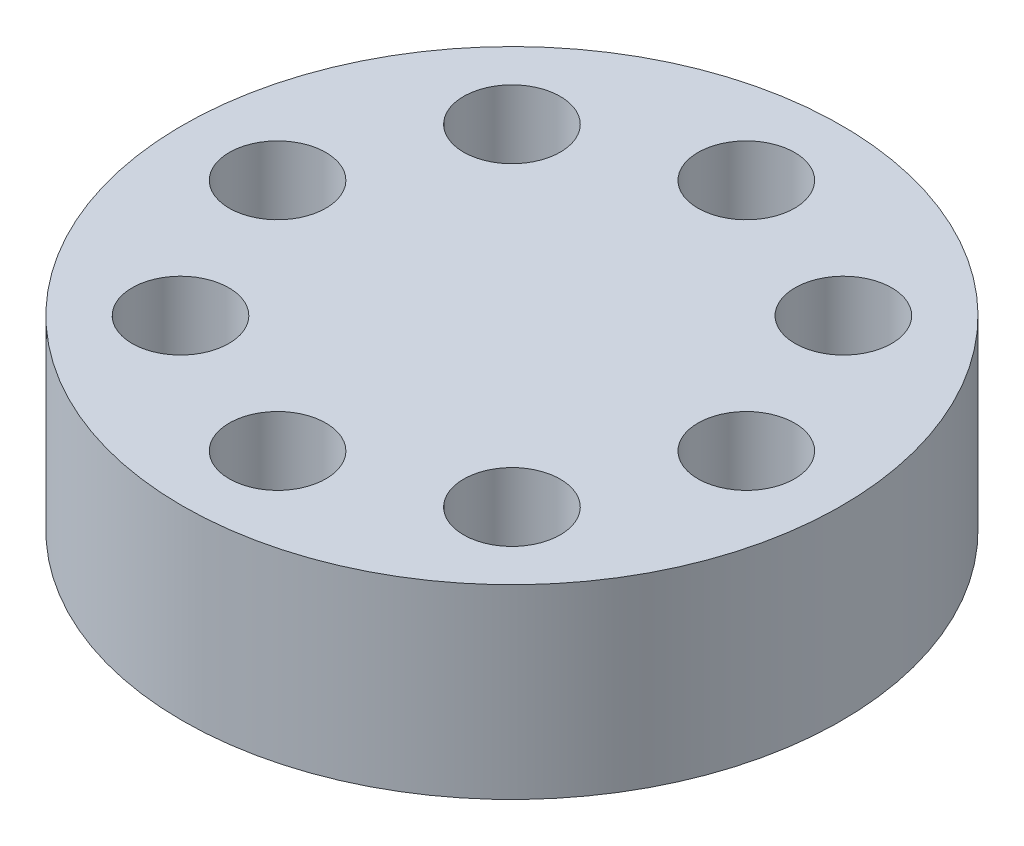
ISO-10303-21;
HEADER;
FILE_DESCRIPTION(('STEP AP214'),'2;1');
FILE_NAME('part.step','',(''),(''),'','','');
FILE_SCHEMA(('AUTOMOTIVE_DESIGN { 1 0 10303 214 1 1 1 1 }'));
ENDSEC;
DATA;
#1=APPLICATION_CONTEXT('core data for automotive mechanical design processes');
#2=APPLICATION_PROTOCOL_DEFINITION('international standard','automotive_design',2000,#1);
#3=PRODUCT_CONTEXT('',#1,'mechanical');
#4=PRODUCT('Part','Part','',(#3));
#5=PRODUCT_RELATED_PRODUCT_CATEGORY('part','',(#4));
#6=PRODUCT_DEFINITION_FORMATION('','',#4);
#7=PRODUCT_DEFINITION_CONTEXT('part definition',#1,'design');
#8=PRODUCT_DEFINITION('design','',#6,#7);
#9=PRODUCT_DEFINITION_SHAPE('','',#8);
#10=(LENGTH_UNIT() NAMED_UNIT(*) SI_UNIT(.MILLI.,.METRE.));
#11=(NAMED_UNIT(*) PLANE_ANGLE_UNIT() SI_UNIT($,.RADIAN.));
#12=(NAMED_UNIT(*) SI_UNIT($,.STERADIAN.) SOLID_ANGLE_UNIT());
#13=UNCERTAINTY_MEASURE_WITH_UNIT(LENGTH_MEASURE(1.E-05),#10,'distance_accuracy_value','');
#14=(GEOMETRIC_REPRESENTATION_CONTEXT(3) GLOBAL_UNCERTAINTY_ASSIGNED_CONTEXT((#13)) GLOBAL_UNIT_ASSIGNED_CONTEXT((#10,
#11,#12)) REPRESENTATION_CONTEXT('',''));
#15=CARTESIAN_POINT('',(0.,0.,0.));
#16=DIRECTION('',(0.,0.,1.));
#17=DIRECTION('',(1.,0.,0.));
#18=AXIS2_PLACEMENT_3D('',#15,#16,#17);
#19=CARTESIAN_POINT('',(0.,12.7,0.));
#20=DIRECTION('',(0.,-1.,0.));
#21=DIRECTION('',(0.,0.,-1.));
#22=AXIS2_PLACEMENT_3D('',#19,#20,#21);
#23=CYLINDRICAL_SURFACE('',#22,22.5);
#24=CARTESIAN_POINT('',(0.,12.7,0.));
#25=DIRECTION('',(0.,1.,0.));
#26=DIRECTION('',(0.,0.,1.));
#27=AXIS2_PLACEMENT_3D('',#24,#25,#26);
#28=CIRCLE('',#27,22.5);
#29=CARTESIAN_POINT('',(0.,12.7,22.5));
#30=VERTEX_POINT('',#29);
#31=EDGE_CURVE('E10',#30,#30,#28,.T.);
#32=ORIENTED_EDGE('',*,*,#31,.F.);
#33=EDGE_LOOP('',(#32));
#34=FACE_BOUND('',#33,.T.);
#35=CARTESIAN_POINT('',(0.,0.,0.));
#36=DIRECTION('',(0.,1.,0.));
#37=DIRECTION('',(0.,0.,1.));
#38=AXIS2_PLACEMENT_3D('',#35,#36,#37);
#39=CIRCLE('',#38,22.5);
#40=CARTESIAN_POINT('',(0.,0.,22.5));
#41=VERTEX_POINT('',#40);
#42=EDGE_CURVE('E40',#41,#41,#39,.T.);
#43=ORIENTED_EDGE('',*,*,#42,.T.);
#44=EDGE_LOOP('',(#43));
#45=FACE_BOUND('',#44,.T.);
#46=ADVANCED_FACE('F37',(#34,#45),#23,.T.);
#47=CARTESIAN_POINT('',(0.,12.7,0.));
#48=DIRECTION('',(0.,1.,0.));
#49=DIRECTION('',(0.,0.,1.));
#50=AXIS2_PLACEMENT_3D('',#47,#48,#49);
#51=PLANE('',#50);
#52=CARTESIAN_POINT('',(-11.3137084989848,12.7,11.3137084989848));
#53=DIRECTION('',(0.,1.,0.));
#54=DIRECTION('',(0.,0.,1.));
#55=AXIS2_PLACEMENT_3D('',#52,#53,#54);
#56=CIRCLE('',#55,3.3);
#57=CARTESIAN_POINT('',(-11.3137084989848,12.7,14.6137084989848));
#58=VERTEX_POINT('',#57);
#59=EDGE_CURVE('E58',#58,#58,#56,.T.);
#60=ORIENTED_EDGE('',*,*,#59,.F.);
#61=EDGE_LOOP('',(#60));
#62=FACE_BOUND('',#61,.T.);
#63=CARTESIAN_POINT('',(-1.6759110426447E-13,12.7,16.));
#64=DIRECTION('',(0.,1.,0.));
#65=DIRECTION('',(0.,0.,1.));
#66=AXIS2_PLACEMENT_3D('',#63,#64,#65);
#67=CIRCLE('',#66,3.3);
#68=CARTESIAN_POINT('',(-1.6759110426447E-13,12.7,19.3));
#69=VERTEX_POINT('',#68);
#70=EDGE_CURVE('E64',#69,#69,#67,.T.);
#71=ORIENTED_EDGE('',*,*,#70,.F.);
#72=EDGE_LOOP('',(#71));
#73=FACE_BOUND('',#72,.T.);
#74=CARTESIAN_POINT('',(11.3137084989847,12.7,11.3137084989849));
#75=DIRECTION('',(0.,1.,0.));
#76=DIRECTION('',(0.,0.,1.));
#77=AXIS2_PLACEMENT_3D('',#74,#75,#76);
#78=CIRCLE('',#77,3.3);
#79=CARTESIAN_POINT('',(11.3137084989847,12.7,14.6137084989849));
#80=VERTEX_POINT('',#79);
#81=EDGE_CURVE('E70',#80,#80,#78,.T.);
#82=ORIENTED_EDGE('',*,*,#81,.F.);
#83=EDGE_LOOP('',(#82));
#84=FACE_BOUND('',#83,.T.);
#85=CARTESIAN_POINT('',(16.,12.7,1.1172740284298E-13));
#86=DIRECTION('',(0.,1.,0.));
#87=DIRECTION('',(0.,0.,1.));
#88=AXIS2_PLACEMENT_3D('',#85,#86,#87);
#89=CIRCLE('',#88,3.3);
#90=CARTESIAN_POINT('',(16.,12.7,3.30000000000011));
#91=VERTEX_POINT('',#90);
#92=EDGE_CURVE('E76',#91,#91,#89,.T.);
#93=ORIENTED_EDGE('',*,*,#92,.F.);
#94=EDGE_LOOP('',(#93));
#95=FACE_BOUND('',#94,.T.);
#96=CARTESIAN_POINT('',(11.3137084989848,12.7,-11.3137084989847));
#97=DIRECTION('',(0.,1.,0.));
#98=DIRECTION('',(0.,0.,1.));
#99=AXIS2_PLACEMENT_3D('',#96,#97,#98);
#100=CIRCLE('',#99,3.3);
#101=CARTESIAN_POINT('',(11.3137084989848,12.7,-8.0137084989847));
#102=VERTEX_POINT('',#101);
#103=EDGE_CURVE('E82',#102,#102,#100,.T.);
#104=ORIENTED_EDGE('',*,*,#103,.F.);
#105=EDGE_LOOP('',(#104));
#106=FACE_BOUND('',#105,.T.);
#107=CARTESIAN_POINT('',(0.,12.7,-16.));
#108=DIRECTION('',(0.,1.,0.));
#109=DIRECTION('',(0.,0.,1.));
#110=AXIS2_PLACEMENT_3D('',#107,#108,#109);
#111=CIRCLE('',#110,3.3);
#112=CARTESIAN_POINT('',(0.,12.7,-12.7));
#113=VERTEX_POINT('',#112);
#114=EDGE_CURVE('E88',#113,#113,#111,.T.);
#115=ORIENTED_EDGE('',*,*,#114,.F.);
#116=EDGE_LOOP('',(#115));
#117=FACE_BOUND('',#116,.T.);
#118=CARTESIAN_POINT('',(-11.3137084989848,12.7,-11.3137084989848));
#119=DIRECTION('',(0.,1.,0.));
#120=DIRECTION('',(0.,0.,1.));
#121=AXIS2_PLACEMENT_3D('',#118,#119,#120);
#122=CIRCLE('',#121,3.3);
#123=CARTESIAN_POINT('',(-11.3137084989848,12.7,-8.01370849898476));
#124=VERTEX_POINT('',#123);
#125=EDGE_CURVE('E52',#124,#124,#122,.T.);
#126=ORIENTED_EDGE('',*,*,#125,.F.);
#127=EDGE_LOOP('',(#126));
#128=FACE_BOUND('',#127,.T.);
#129=CARTESIAN_POINT('',(-16.,12.7,0.));
#130=DIRECTION('',(0.,1.,0.));
#131=DIRECTION('',(0.,0.,1.));
#132=AXIS2_PLACEMENT_3D('',#129,#130,#131);
#133=CIRCLE('',#132,3.3);
#134=CARTESIAN_POINT('',(-16.,12.7,3.3));
#135=VERTEX_POINT('',#134);
#136=EDGE_CURVE('E49',#135,#135,#133,.T.);
#137=ORIENTED_EDGE('',*,*,#136,.F.);
#138=EDGE_LOOP('',(#137));
#139=FACE_BOUND('',#138,.T.);
#140=ORIENTED_EDGE('',*,*,#31,.T.);
#141=EDGE_LOOP('',(#140));
#142=FACE_BOUND('',#141,.T.);
#143=ADVANCED_FACE('F99',(#62,#73,#84,#95,#106,#117,#128,#139,#142),#51,.T.);
#144=CARTESIAN_POINT('',(0.,0.,0.));
#145=DIRECTION('',(0.,1.,0.));
#146=DIRECTION('',(0.,0.,1.));
#147=AXIS2_PLACEMENT_3D('',#144,#145,#146);
#148=PLANE('',#147);
#149=CARTESIAN_POINT('',(-11.3137084989848,0.,11.3137084989848));
#150=DIRECTION('',(0.,1.,0.));
#151=DIRECTION('',(0.,0.,1.));
#152=AXIS2_PLACEMENT_3D('',#149,#150,#151);
#153=CIRCLE('',#152,3.3);
#154=CARTESIAN_POINT('',(-11.3137084989848,0.,14.6137084989848));
#155=VERTEX_POINT('',#154);
#156=EDGE_CURVE('E55',#155,#155,#153,.T.);
#157=ORIENTED_EDGE('',*,*,#156,.T.);
#158=EDGE_LOOP('',(#157));
#159=FACE_BOUND('',#158,.T.);
#160=CARTESIAN_POINT('',(-1.6759110426447E-13,0.,16.));
#161=DIRECTION('',(0.,1.,0.));
#162=DIRECTION('',(0.,0.,1.));
#163=AXIS2_PLACEMENT_3D('',#160,#161,#162);
#164=CIRCLE('',#163,3.3);
#165=CARTESIAN_POINT('',(-1.6759110426447E-13,0.,19.3));
#166=VERTEX_POINT('',#165);
#167=EDGE_CURVE('E61',#166,#166,#164,.T.);
#168=ORIENTED_EDGE('',*,*,#167,.T.);
#169=EDGE_LOOP('',(#168));
#170=FACE_BOUND('',#169,.T.);
#171=CARTESIAN_POINT('',(11.3137084989847,0.,11.3137084989849));
#172=DIRECTION('',(0.,1.,0.));
#173=DIRECTION('',(0.,0.,1.));
#174=AXIS2_PLACEMENT_3D('',#171,#172,#173);
#175=CIRCLE('',#174,3.3);
#176=CARTESIAN_POINT('',(11.3137084989847,0.,14.6137084989849));
#177=VERTEX_POINT('',#176);
#178=EDGE_CURVE('E67',#177,#177,#175,.T.);
#179=ORIENTED_EDGE('',*,*,#178,.T.);
#180=EDGE_LOOP('',(#179));
#181=FACE_BOUND('',#180,.T.);
#182=CARTESIAN_POINT('',(16.,0.,1.1172740284298E-13));
#183=DIRECTION('',(0.,1.,0.));
#184=DIRECTION('',(0.,0.,1.));
#185=AXIS2_PLACEMENT_3D('',#182,#183,#184);
#186=CIRCLE('',#185,3.3);
#187=CARTESIAN_POINT('',(16.,0.,3.30000000000011));
#188=VERTEX_POINT('',#187);
#189=EDGE_CURVE('E73',#188,#188,#186,.T.);
#190=ORIENTED_EDGE('',*,*,#189,.T.);
#191=EDGE_LOOP('',(#190));
#192=FACE_BOUND('',#191,.T.);
#193=CARTESIAN_POINT('',(11.3137084989848,0.,-11.3137084989847));
#194=DIRECTION('',(0.,1.,0.));
#195=DIRECTION('',(0.,0.,1.));
#196=AXIS2_PLACEMENT_3D('',#193,#194,#195);
#197=CIRCLE('',#196,3.3);
#198=CARTESIAN_POINT('',(11.3137084989848,0.,-8.0137084989847));
#199=VERTEX_POINT('',#198);
#200=EDGE_CURVE('E79',#199,#199,#197,.T.);
#201=ORIENTED_EDGE('',*,*,#200,.T.);
#202=EDGE_LOOP('',(#201));
#203=FACE_BOUND('',#202,.T.);
#204=CARTESIAN_POINT('',(0.,0.,-16.));
#205=DIRECTION('',(0.,1.,0.));
#206=DIRECTION('',(0.,0.,1.));
#207=AXIS2_PLACEMENT_3D('',#204,#205,#206);
#208=CIRCLE('',#207,3.3);
#209=CARTESIAN_POINT('',(0.,0.,-12.7));
#210=VERTEX_POINT('',#209);
#211=EDGE_CURVE('E85',#210,#210,#208,.T.);
#212=ORIENTED_EDGE('',*,*,#211,.T.);
#213=EDGE_LOOP('',(#212));
#214=FACE_BOUND('',#213,.T.);
#215=CARTESIAN_POINT('',(-11.3137084989848,0.,-11.3137084989848));
#216=DIRECTION('',(0.,1.,0.));
#217=DIRECTION('',(0.,0.,1.));
#218=AXIS2_PLACEMENT_3D('',#215,#216,#217);
#219=CIRCLE('',#218,3.3);
#220=CARTESIAN_POINT('',(-11.3137084989848,0.,-8.01370849898476));
#221=VERTEX_POINT('',#220);
#222=EDGE_CURVE('E91',#221,#221,#219,.T.);
#223=ORIENTED_EDGE('',*,*,#222,.T.);
#224=EDGE_LOOP('',(#223));
#225=FACE_BOUND('',#224,.T.);
#226=CARTESIAN_POINT('',(-16.,0.,0.));
#227=DIRECTION('',(0.,1.,0.));
#228=DIRECTION('',(0.,0.,1.));
#229=AXIS2_PLACEMENT_3D('',#226,#227,#228);
#230=CIRCLE('',#229,3.3);
#231=CARTESIAN_POINT('',(-16.,0.,3.3));
#232=VERTEX_POINT('',#231);
#233=EDGE_CURVE('E47',#232,#232,#230,.T.);
#234=ORIENTED_EDGE('',*,*,#233,.T.);
#235=EDGE_LOOP('',(#234));
#236=FACE_BOUND('',#235,.T.);
#237=ORIENTED_EDGE('',*,*,#42,.F.);
#238=EDGE_LOOP('',(#237));
#239=FACE_BOUND('',#238,.T.);
#240=ADVANCED_FACE('F102',(#159,#170,#181,#192,#203,#214,#225,#236,#239),#148,.F.);
#241=CARTESIAN_POINT('',(-16.,0.,0.));
#242=DIRECTION('',(0.,1.,0.));
#243=DIRECTION('',(0.,0.,1.));
#244=AXIS2_PLACEMENT_3D('',#241,#242,#243);
#245=CYLINDRICAL_SURFACE('',#244,3.3);
#246=ORIENTED_EDGE('',*,*,#233,.F.);
#247=EDGE_LOOP('',(#246));
#248=FACE_BOUND('',#247,.T.);
#249=ORIENTED_EDGE('',*,*,#136,.T.);
#250=EDGE_LOOP('',(#249));
#251=FACE_BOUND('',#250,.T.);
#252=ADVANCED_FACE('F107',(#248,#251),#245,.F.);
#253=CARTESIAN_POINT('',(-11.3137084989848,0.,-11.3137084989848));
#254=DIRECTION('',(0.,1.,0.));
#255=DIRECTION('',(0.,0.,1.));
#256=AXIS2_PLACEMENT_3D('',#253,#254,#255);
#257=CYLINDRICAL_SURFACE('',#256,3.3);
#258=ORIENTED_EDGE('',*,*,#222,.F.);
#259=EDGE_LOOP('',(#258));
#260=FACE_BOUND('',#259,.T.);
#261=ORIENTED_EDGE('',*,*,#125,.T.);
#262=EDGE_LOOP('',(#261));
#263=FACE_BOUND('',#262,.T.);
#264=ADVANCED_FACE('F97',(#260,#263),#257,.F.);
#265=CARTESIAN_POINT('',(0.,0.,-16.));
#266=DIRECTION('',(0.,1.,0.));
#267=DIRECTION('',(0.,0.,1.));
#268=AXIS2_PLACEMENT_3D('',#265,#266,#267);
#269=CYLINDRICAL_SURFACE('',#268,3.3);
#270=ORIENTED_EDGE('',*,*,#211,.F.);
#271=EDGE_LOOP('',(#270));
#272=FACE_BOUND('',#271,.T.);
#273=ORIENTED_EDGE('',*,*,#114,.T.);
#274=EDGE_LOOP('',(#273));
#275=FACE_BOUND('',#274,.T.);
#276=ADVANCED_FACE('F115',(#272,#275),#269,.F.);
#277=CARTESIAN_POINT('',(11.3137084989848,0.,-11.3137084989847));
#278=DIRECTION('',(0.,1.,0.));
#279=DIRECTION('',(0.,0.,1.));
#280=AXIS2_PLACEMENT_3D('',#277,#278,#279);
#281=CYLINDRICAL_SURFACE('',#280,3.3);
#282=ORIENTED_EDGE('',*,*,#200,.F.);
#283=EDGE_LOOP('',(#282));
#284=FACE_BOUND('',#283,.T.);
#285=ORIENTED_EDGE('',*,*,#103,.T.);
#286=EDGE_LOOP('',(#285));
#287=FACE_BOUND('',#286,.T.);
#288=ADVANCED_FACE('F158',(#284,#287),#281,.F.);
#289=CARTESIAN_POINT('',(16.,0.,1.1172740284298E-13));
#290=DIRECTION('',(0.,1.,0.));
#291=DIRECTION('',(0.,0.,1.));
#292=AXIS2_PLACEMENT_3D('',#289,#290,#291);
#293=CYLINDRICAL_SURFACE('',#292,3.3);
#294=ORIENTED_EDGE('',*,*,#189,.F.);
#295=EDGE_LOOP('',(#294));
#296=FACE_BOUND('',#295,.T.);
#297=ORIENTED_EDGE('',*,*,#92,.T.);
#298=EDGE_LOOP('',(#297));
#299=FACE_BOUND('',#298,.T.);
#300=ADVANCED_FACE('F168',(#296,#299),#293,.F.);
#301=CARTESIAN_POINT('',(11.3137084989847,0.,11.3137084989849));
#302=DIRECTION('',(0.,1.,0.));
#303=DIRECTION('',(0.,0.,1.));
#304=AXIS2_PLACEMENT_3D('',#301,#302,#303);
#305=CYLINDRICAL_SURFACE('',#304,3.3);
#306=ORIENTED_EDGE('',*,*,#178,.F.);
#307=EDGE_LOOP('',(#306));
#308=FACE_BOUND('',#307,.T.);
#309=ORIENTED_EDGE('',*,*,#81,.T.);
#310=EDGE_LOOP('',(#309));
#311=FACE_BOUND('',#310,.T.);
#312=ADVANCED_FACE('F178',(#308,#311),#305,.F.);
#313=CARTESIAN_POINT('',(-1.6759110426447E-13,0.,16.));
#314=DIRECTION('',(0.,1.,0.));
#315=DIRECTION('',(0.,0.,1.));
#316=AXIS2_PLACEMENT_3D('',#313,#314,#315);
#317=CYLINDRICAL_SURFACE('',#316,3.3);
#318=ORIENTED_EDGE('',*,*,#167,.F.);
#319=EDGE_LOOP('',(#318));
#320=FACE_BOUND('',#319,.T.);
#321=ORIENTED_EDGE('',*,*,#70,.T.);
#322=EDGE_LOOP('',(#321));
#323=FACE_BOUND('',#322,.T.);
#324=ADVANCED_FACE('F188',(#320,#323),#317,.F.);
#325=CARTESIAN_POINT('',(-11.3137084989848,0.,11.3137084989848));
#326=DIRECTION('',(0.,1.,0.));
#327=DIRECTION('',(0.,0.,1.));
#328=AXIS2_PLACEMENT_3D('',#325,#326,#327);
#329=CYLINDRICAL_SURFACE('',#328,3.3);
#330=ORIENTED_EDGE('',*,*,#156,.F.);
#331=EDGE_LOOP('',(#330));
#332=FACE_BOUND('',#331,.T.);
#333=ORIENTED_EDGE('',*,*,#59,.T.);
#334=EDGE_LOOP('',(#333));
#335=FACE_BOUND('',#334,.T.);
#336=ADVANCED_FACE('F198',(#332,#335),#329,.F.);
#337=CLOSED_SHELL('',(#46,#143,#240,#252,#264,#276,#288,#300,#312,#324,#336));
#338=MANIFOLD_SOLID_BREP('B2',#337);
#339=ADVANCED_BREP_SHAPE_REPRESENTATION('',(#18,#338),#14);
#340=SHAPE_DEFINITION_REPRESENTATION(#9,#339);
ENDSEC;
END-ISO-10303-21;
